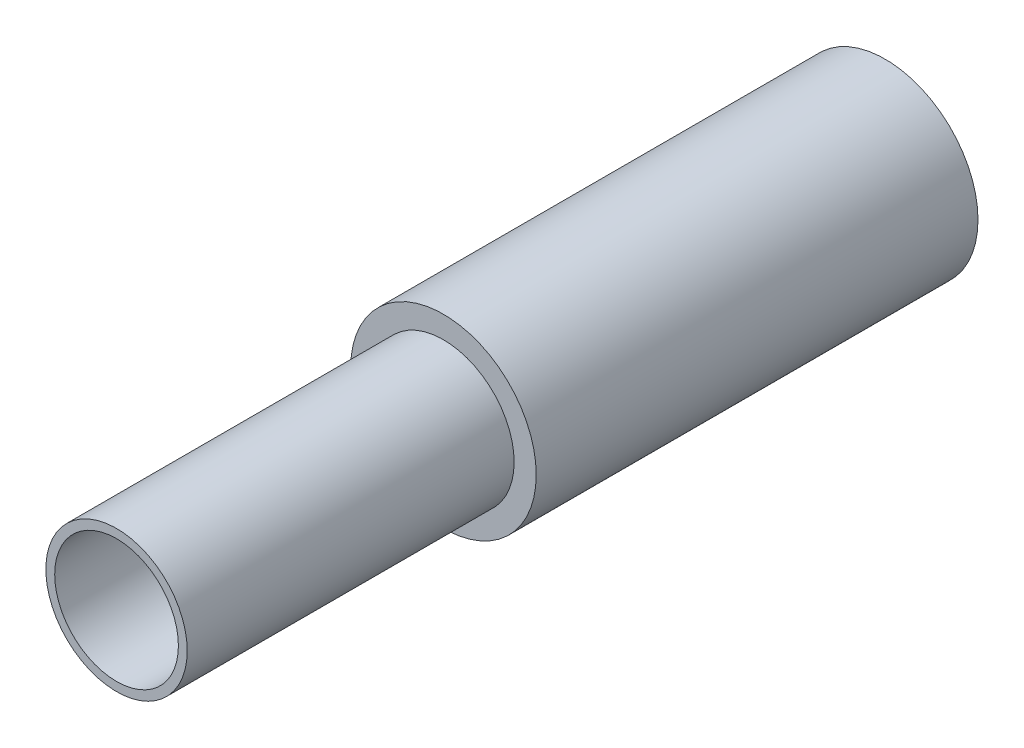
ISO-10303-21;
HEADER;
FILE_DESCRIPTION(('STEP AP214'),'2;1');
FILE_NAME('part.step','',(''),(''),'','','');
FILE_SCHEMA(('AUTOMOTIVE_DESIGN { 1 0 10303 214 1 1 1 1 }'));
ENDSEC;
DATA;
#1=APPLICATION_CONTEXT('core data for automotive mechanical design processes');
#2=APPLICATION_PROTOCOL_DEFINITION('international standard','automotive_design',2000,#1);
#3=PRODUCT_CONTEXT('',#1,'mechanical');
#4=PRODUCT('Part','Part','',(#3));
#5=PRODUCT_RELATED_PRODUCT_CATEGORY('part','',(#4));
#6=PRODUCT_DEFINITION_FORMATION('','',#4);
#7=PRODUCT_DEFINITION_CONTEXT('part definition',#1,'design');
#8=PRODUCT_DEFINITION('design','',#6,#7);
#9=PRODUCT_DEFINITION_SHAPE('','',#8);
#10=(LENGTH_UNIT() NAMED_UNIT(*) SI_UNIT(.MILLI.,.METRE.));
#11=(NAMED_UNIT(*) PLANE_ANGLE_UNIT() SI_UNIT($,.RADIAN.));
#12=(NAMED_UNIT(*) SI_UNIT($,.STERADIAN.) SOLID_ANGLE_UNIT());
#13=UNCERTAINTY_MEASURE_WITH_UNIT(LENGTH_MEASURE(1.E-05),#10,'distance_accuracy_value','');
#14=(GEOMETRIC_REPRESENTATION_CONTEXT(3) GLOBAL_UNCERTAINTY_ASSIGNED_CONTEXT((#13)) GLOBAL_UNIT_ASSIGNED_CONTEXT((#10,
#11,#12)) REPRESENTATION_CONTEXT('',''));
#15=CARTESIAN_POINT('',(0.,0.,0.));
#16=DIRECTION('',(0.,0.,1.));
#17=DIRECTION('',(1.,0.,0.));
#18=AXIS2_PLACEMENT_3D('',#15,#16,#17);
#19=CARTESIAN_POINT('',(0.,0.,37.));
#20=DIRECTION('',(0.,0.,-1.));
#21=DIRECTION('',(-1.,0.,0.));
#22=AXIS2_PLACEMENT_3D('',#19,#20,#21);
#23=CYLINDRICAL_SURFACE('',#22,8.);
#24=CARTESIAN_POINT('',(0.,0.,37.));
#25=DIRECTION('',(0.,0.,1.));
#26=DIRECTION('',(1.,0.,0.));
#27=AXIS2_PLACEMENT_3D('',#24,#25,#26);
#28=CIRCLE('',#27,8.);
#29=CARTESIAN_POINT('',(8.,0.,37.));
#30=VERTEX_POINT('',#29);
#31=EDGE_CURVE('E10',#30,#30,#28,.T.);
#32=ORIENTED_EDGE('',*,*,#31,.F.);
#33=EDGE_LOOP('',(#32));
#34=FACE_BOUND('',#33,.T.);
#35=CARTESIAN_POINT('',(0.,0.,0.));
#36=DIRECTION('',(0.,0.,1.));
#37=DIRECTION('',(1.,0.,0.));
#38=AXIS2_PLACEMENT_3D('',#35,#36,#37);
#39=CIRCLE('',#38,8.);
#40=CARTESIAN_POINT('',(8.,0.,0.));
#41=VERTEX_POINT('',#40);
#42=EDGE_CURVE('E40',#41,#41,#39,.T.);
#43=ORIENTED_EDGE('',*,*,#42,.T.);
#44=EDGE_LOOP('',(#43));
#45=FACE_BOUND('',#44,.T.);
#46=ADVANCED_FACE('F37',(#34,#45),#23,.T.);
#47=CARTESIAN_POINT('',(0.,0.,37.));
#48=DIRECTION('',(0.,0.,1.));
#49=DIRECTION('',(1.,0.,0.));
#50=AXIS2_PLACEMENT_3D('',#47,#48,#49);
#51=PLANE('',#50);
#52=CARTESIAN_POINT('',(0.,0.,37.));
#53=DIRECTION('',(0.,0.,1.));
#54=DIRECTION('',(1.,0.,0.));
#55=AXIS2_PLACEMENT_3D('',#52,#53,#54);
#56=CIRCLE('',#55,7.);
#57=CARTESIAN_POINT('',(7.,0.,37.));
#58=VERTEX_POINT('',#57);
#59=EDGE_CURVE('E52',#58,#58,#56,.T.);
#60=ORIENTED_EDGE('',*,*,#59,.F.);
#61=EDGE_LOOP('',(#60));
#62=FACE_BOUND('',#61,.T.);
#63=ORIENTED_EDGE('',*,*,#31,.T.);
#64=EDGE_LOOP('',(#63));
#65=FACE_BOUND('',#64,.T.);
#66=ADVANCED_FACE('F79',(#62,#65),#51,.T.);
#67=CARTESIAN_POINT('',(0.,0.,-50.));
#68=DIRECTION('',(0.,0.,1.));
#69=DIRECTION('',(1.,0.,0.));
#70=AXIS2_PLACEMENT_3D('',#67,#68,#69);
#71=CYLINDRICAL_SURFACE('',#70,10.5);
#72=CARTESIAN_POINT('',(0.,0.,-50.));
#73=DIRECTION('',(0.,0.,-1.));
#74=DIRECTION('',(-1.,0.,0.));
#75=AXIS2_PLACEMENT_3D('',#72,#73,#74);
#76=CIRCLE('',#75,10.5);
#77=CARTESIAN_POINT('',(-10.5,0.,-50.));
#78=VERTEX_POINT('',#77);
#79=EDGE_CURVE('E47',#78,#78,#76,.T.);
#80=ORIENTED_EDGE('',*,*,#79,.F.);
#81=EDGE_LOOP('',(#80));
#82=FACE_BOUND('',#81,.T.);
#83=CARTESIAN_POINT('',(0.,0.,0.));
#84=DIRECTION('',(0.,0.,-1.));
#85=DIRECTION('',(-1.,0.,0.));
#86=AXIS2_PLACEMENT_3D('',#83,#84,#85);
#87=CIRCLE('',#86,10.5);
#88=CARTESIAN_POINT('',(-10.5,0.,0.));
#89=VERTEX_POINT('',#88);
#90=EDGE_CURVE('E49',#89,#89,#87,.T.);
#91=ORIENTED_EDGE('',*,*,#90,.T.);
#92=EDGE_LOOP('',(#91));
#93=FACE_BOUND('',#92,.T.);
#94=ADVANCED_FACE('F73',(#82,#93),#71,.T.);
#95=CARTESIAN_POINT('',(0.,0.,-50.));
#96=DIRECTION('',(0.,0.,-1.));
#97=DIRECTION('',(-1.,0.,0.));
#98=AXIS2_PLACEMENT_3D('',#95,#96,#97);
#99=PLANE('',#98);
#100=CARTESIAN_POINT('',(0.,0.,-50.));
#101=DIRECTION('',(0.,0.,-1.));
#102=DIRECTION('',(-1.,0.,0.));
#103=AXIS2_PLACEMENT_3D('',#100,#101,#102);
#104=CIRCLE('',#103,9.5);
#105=CARTESIAN_POINT('',(-9.5,0.,-50.));
#106=VERTEX_POINT('',#105);
#107=EDGE_CURVE('E61',#106,#106,#104,.T.);
#108=ORIENTED_EDGE('',*,*,#107,.F.);
#109=EDGE_LOOP('',(#108));
#110=FACE_BOUND('',#109,.T.);
#111=ORIENTED_EDGE('',*,*,#79,.T.);
#112=EDGE_LOOP('',(#111));
#113=FACE_BOUND('',#112,.T.);
#114=ADVANCED_FACE('F69',(#110,#113),#99,.T.);
#115=CARTESIAN_POINT('',(0.,0.,0.));
#116=DIRECTION('',(0.,0.,-1.));
#117=DIRECTION('',(-1.,0.,0.));
#118=AXIS2_PLACEMENT_3D('',#115,#116,#117);
#119=PLANE('',#118);
#120=ORIENTED_EDGE('',*,*,#42,.F.);
#121=EDGE_LOOP('',(#120));
#122=FACE_BOUND('',#121,.T.);
#123=ORIENTED_EDGE('',*,*,#90,.F.);
#124=EDGE_LOOP('',(#123));
#125=FACE_BOUND('',#124,.T.);
#126=ADVANCED_FACE('F72',(#122,#125),#119,.F.);
#127=CARTESIAN_POINT('',(0.,0.,37.));
#128=DIRECTION('',(0.,0.,-1.));
#129=DIRECTION('',(-1.,0.,0.));
#130=AXIS2_PLACEMENT_3D('',#127,#128,#129);
#131=CYLINDRICAL_SURFACE('',#130,7.);
#132=ORIENTED_EDGE('',*,*,#59,.T.);
#133=EDGE_LOOP('',(#132));
#134=FACE_BOUND('',#133,.T.);
#135=CARTESIAN_POINT('',(0.,0.,-1.));
#136=DIRECTION('',(0.,0.,-1.));
#137=DIRECTION('',(-1.,0.,0.));
#138=AXIS2_PLACEMENT_3D('',#135,#136,#137);
#139=CIRCLE('',#138,7.);
#140=CARTESIAN_POINT('',(-7.,0.,-1.));
#141=VERTEX_POINT('',#140);
#142=EDGE_CURVE('E57',#141,#141,#139,.F.);
#143=ORIENTED_EDGE('',*,*,#142,.F.);
#144=EDGE_LOOP('',(#143));
#145=FACE_BOUND('',#144,.T.);
#146=ADVANCED_FACE('F84',(#134,#145),#131,.F.);
#147=CARTESIAN_POINT('',(0.,0.,-50.));
#148=DIRECTION('',(0.,0.,1.));
#149=DIRECTION('',(1.,0.,0.));
#150=AXIS2_PLACEMENT_3D('',#147,#148,#149);
#151=CYLINDRICAL_SURFACE('',#150,9.5);
#152=CARTESIAN_POINT('',(0.,0.,-1.));
#153=DIRECTION('',(0.,0.,-1.));
#154=DIRECTION('',(-1.,0.,0.));
#155=AXIS2_PLACEMENT_3D('',#152,#153,#154);
#156=CIRCLE('',#155,9.5);
#157=CARTESIAN_POINT('',(-9.5,0.,-1.));
#158=VERTEX_POINT('',#157);
#159=EDGE_CURVE('E58',#158,#158,#156,.T.);
#160=ORIENTED_EDGE('',*,*,#159,.F.);
#161=EDGE_LOOP('',(#160));
#162=FACE_BOUND('',#161,.T.);
#163=ORIENTED_EDGE('',*,*,#107,.T.);
#164=EDGE_LOOP('',(#163));
#165=FACE_BOUND('',#164,.T.);
#166=ADVANCED_FACE('F67',(#162,#165),#151,.F.);
#167=CARTESIAN_POINT('',(0.,0.,-1.));
#168=DIRECTION('',(0.,0.,-1.));
#169=DIRECTION('',(-1.,0.,0.));
#170=AXIS2_PLACEMENT_3D('',#167,#168,#169);
#171=PLANE('',#170);
#172=ORIENTED_EDGE('',*,*,#142,.T.);
#173=EDGE_LOOP('',(#172));
#174=FACE_BOUND('',#173,.T.);
#175=ORIENTED_EDGE('',*,*,#159,.T.);
#176=EDGE_LOOP('',(#175));
#177=FACE_BOUND('',#176,.T.);
#178=ADVANCED_FACE('F106',(#174,#177),#171,.T.);
#179=CLOSED_SHELL('',(#46,#66,#94,#114,#126,#146,#166,#178));
#180=MANIFOLD_SOLID_BREP('B2',#179);
#181=ADVANCED_BREP_SHAPE_REPRESENTATION('',(#18,#180),#14);
#182=SHAPE_DEFINITION_REPRESENTATION(#9,#181);
ENDSEC;
END-ISO-10303-21;
